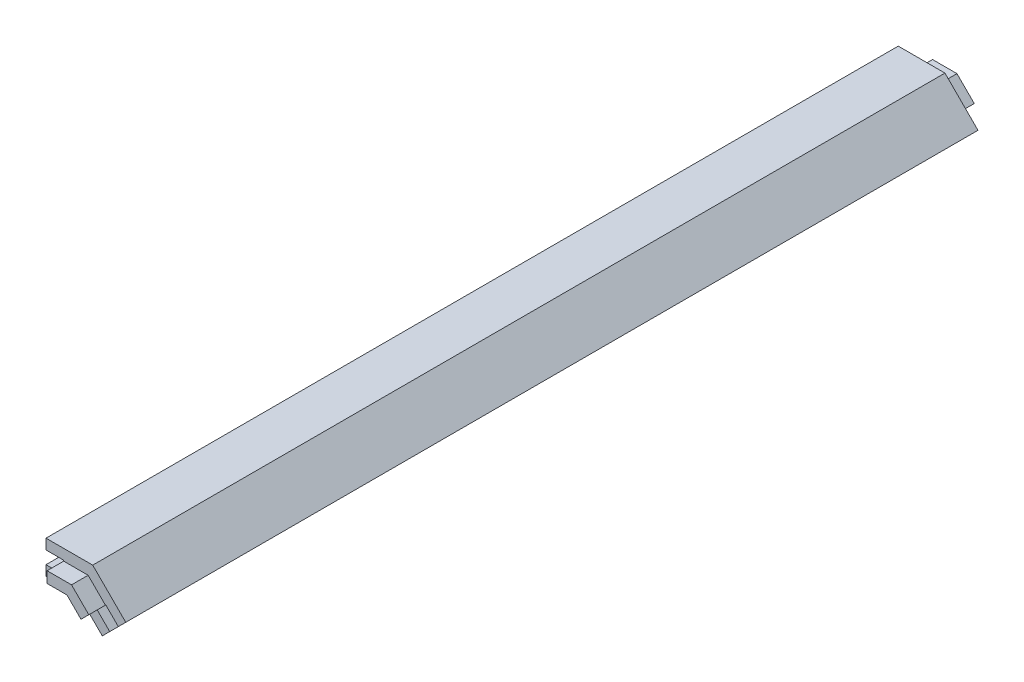
ISO-10303-21;
HEADER;
FILE_DESCRIPTION(('STEP AP214'),'2;1');
FILE_NAME('part.step','',(''),(''),'','','');
FILE_SCHEMA(('AUTOMOTIVE_DESIGN { 1 0 10303 214 1 1 1 1 }'));
ENDSEC;
DATA;
#1=APPLICATION_CONTEXT('core data for automotive mechanical design processes');
#2=APPLICATION_PROTOCOL_DEFINITION('international standard','automotive_design',2000,#1);
#3=PRODUCT_CONTEXT('',#1,'mechanical');
#4=PRODUCT('Part','Part','',(#3));
#5=PRODUCT_RELATED_PRODUCT_CATEGORY('part','',(#4));
#6=PRODUCT_DEFINITION_FORMATION('','',#4);
#7=PRODUCT_DEFINITION_CONTEXT('part definition',#1,'design');
#8=PRODUCT_DEFINITION('design','',#6,#7);
#9=PRODUCT_DEFINITION_SHAPE('','',#8);
#10=(LENGTH_UNIT() NAMED_UNIT(*) SI_UNIT(.MILLI.,.METRE.));
#11=(NAMED_UNIT(*) PLANE_ANGLE_UNIT() SI_UNIT($,.RADIAN.));
#12=(NAMED_UNIT(*) SI_UNIT($,.STERADIAN.) SOLID_ANGLE_UNIT());
#13=UNCERTAINTY_MEASURE_WITH_UNIT(LENGTH_MEASURE(1.E-05),#10,'distance_accuracy_value','');
#14=(GEOMETRIC_REPRESENTATION_CONTEXT(3) GLOBAL_UNCERTAINTY_ASSIGNED_CONTEXT((#13)) GLOBAL_UNIT_ASSIGNED_CONTEXT((#10,
#11,#12)) REPRESENTATION_CONTEXT('',''));
#15=CARTESIAN_POINT('',(0.,0.,0.));
#16=DIRECTION('',(0.,0.,1.));
#17=DIRECTION('',(1.,0.,0.));
#18=AXIS2_PLACEMENT_3D('',#15,#16,#17);
#19=CARTESIAN_POINT('',(0.,0.,392.5));
#20=DIRECTION('',(0.,0.,-1.));
#21=DIRECTION('',(-1.,0.,0.));
#22=AXIS2_PLACEMENT_3D('',#19,#20,#21);
#23=PLANE('',#22);
#24=DIRECTION('',(-1.,0.,0.));
#25=VECTOR('',#24,1.);
#26=CARTESIAN_POINT('',(11.0355339059327,2.5,392.5));
#27=LINE('',#26,#25);
#28=CARTESIAN_POINT('',(11.0355339059327,2.5,392.5));
#29=VERTEX_POINT('',#28);
#30=CARTESIAN_POINT('',(0.,2.5,392.5));
#31=VERTEX_POINT('',#30);
#32=EDGE_CURVE('E61',#29,#31,#27,.T.);
#33=ORIENTED_EDGE('',*,*,#32,.F.);
#34=DIRECTION('',(-0.707106781186548,0.707106781186548,0.));
#35=VECTOR('',#34,1.);
#36=CARTESIAN_POINT('',(18.8388347648318,-5.3033008588991,392.5));
#37=LINE('',#36,#35);
#38=CARTESIAN_POINT('',(18.8388347648318,-5.3033008588991,392.5));
#39=VERTEX_POINT('',#38);
#40=EDGE_CURVE('E530',#39,#29,#37,.T.);
#41=ORIENTED_EDGE('',*,*,#40,.F.);
#42=DIRECTION('',(0.707106781186548,0.707106781186547,0.));
#43=VECTOR('',#42,1.);
#44=CARTESIAN_POINT('',(15.1265241636025,-9.01561146012849,392.5));
#45=LINE('',#44,#43);
#46=CARTESIAN_POINT('',(19.0156114601285,-5.12652416360248,392.5));
#47=VERTEX_POINT('',#46);
#48=EDGE_CURVE('E270',#39,#47,#45,.T.);
#49=ORIENTED_EDGE('',*,*,#48,.T.);
#50=DIRECTION('',(0.707106781186549,-0.707106781186546,0.));
#51=VECTOR('',#50,1.);
#52=CARTESIAN_POINT('',(24.6724657096209,-10.7833784130948,392.5));
#53=LINE('',#52,#51);
#54=CARTESIAN_POINT('',(24.6724657096209,-10.7833784130948,392.5));
#55=VERTEX_POINT('',#54);
#56=EDGE_CURVE('E274',#47,#55,#53,.T.);
#57=ORIENTED_EDGE('',*,*,#56,.T.);
#58=DIRECTION('',(0.707106781186547,0.707106781186548,0.));
#59=VECTOR('',#58,1.);
#60=CARTESIAN_POINT('',(24.6724657096209,-10.7833784130948,392.5));
#61=LINE('',#60,#59);
#62=CARTESIAN_POINT('',(28.031222920257,-7.42462120245874,392.5));
#63=VERTEX_POINT('',#62);
#64=EDGE_CURVE('E277',#55,#63,#61,.T.);
#65=ORIENTED_EDGE('',*,*,#64,.T.);
#66=DIRECTION('',(-0.707106781186548,0.707106781186547,0.));
#67=VECTOR('',#66,1.);
#68=CARTESIAN_POINT('',(28.031222920257,-7.42462120245874,392.5));
#69=LINE('',#68,#67);
#70=CARTESIAN_POINT('',(13.1066017177982,7.50000000000003,392.5));
#71=VERTEX_POINT('',#70);
#72=EDGE_CURVE('E280',#63,#71,#69,.T.);
#73=ORIENTED_EDGE('',*,*,#72,.T.);
#74=DIRECTION('',(-1.,0.,0.));
#75=VECTOR('',#74,1.);
#76=CARTESIAN_POINT('',(13.1066017177982,7.50000000000003,392.5));
#77=LINE('',#76,#75);
#78=CARTESIAN_POINT('',(-8.,7.50000000000003,392.5));
#79=VERTEX_POINT('',#78);
#80=EDGE_CURVE('E283',#71,#79,#77,.T.);
#81=ORIENTED_EDGE('',*,*,#80,.T.);
#82=DIRECTION('',(0.,-1.,0.));
#83=VECTOR('',#82,1.);
#84=CARTESIAN_POINT('',(-8.,7.50000000000003,392.5));
#85=LINE('',#84,#83);
#86=CARTESIAN_POINT('',(-8.,2.875,392.5));
#87=VERTEX_POINT('',#86);
#88=EDGE_CURVE('E286',#79,#87,#85,.T.);
#89=ORIENTED_EDGE('',*,*,#88,.T.);
#90=DIRECTION('',(1.,0.,0.));
#91=VECTOR('',#90,1.);
#92=CARTESIAN_POINT('',(-8.,2.875,392.5));
#93=LINE('',#92,#91);
#94=CARTESIAN_POINT('',(0.,2.875,392.5));
#95=VERTEX_POINT('',#94);
#96=EDGE_CURVE('E289',#87,#95,#93,.T.);
#97=ORIENTED_EDGE('',*,*,#96,.T.);
#98=DIRECTION('',(0.,-1.,0.));
#99=VECTOR('',#98,1.);
#100=CARTESIAN_POINT('',(0.,2.875,392.5));
#101=LINE('',#100,#99);
#102=EDGE_CURVE('E292',#95,#31,#101,.T.);
#103=ORIENTED_EDGE('',*,*,#102,.T.);
#104=EDGE_LOOP('',(#33,#41,#49,#57,#65,#73,#81,#89,#97,#103));
#105=FACE_BOUND('',#104,.T.);
#106=ADVANCED_FACE('F45',(#105),#23,.F.);
#107=DIRECTION('',(0.707106781186547,-0.707106781186548,0.));
#108=VECTOR('',#107,1.);
#109=CARTESIAN_POINT('',(8.96446609406726,-2.5,392.5));
#110=LINE('',#109,#108);
#111=CARTESIAN_POINT('',(8.96446609406726,-2.5,392.5));
#112=VERTEX_POINT('',#111);
#113=CARTESIAN_POINT('',(15.3033008588991,-8.83883476483184,392.5));
#114=VERTEX_POINT('',#113);
#115=EDGE_CURVE('E533',#112,#114,#110,.T.);
#116=ORIENTED_EDGE('',*,*,#115,.F.);
#117=DIRECTION('',(1.,0.,0.));
#118=VECTOR('',#117,1.);
#119=CARTESIAN_POINT('',(0.,-2.5,392.5));
#120=LINE('',#119,#118);
#121=CARTESIAN_POINT('',(0.,-2.5,392.5));
#122=VERTEX_POINT('',#121);
#123=EDGE_CURVE('E69',#122,#112,#120,.T.);
#124=ORIENTED_EDGE('',*,*,#123,.F.);
#125=CARTESIAN_POINT('',(0.,-2.875,392.5));
#126=VERTEX_POINT('',#125);
#127=EDGE_CURVE('E243',#122,#126,#101,.T.);
#128=ORIENTED_EDGE('',*,*,#127,.T.);
#129=DIRECTION('',(-1.,0.,0.));
#130=VECTOR('',#129,1.);
#131=CARTESIAN_POINT('',(-8.,-2.875,392.5));
#132=LINE('',#131,#130);
#133=CARTESIAN_POINT('',(-8.,-2.875,392.5));
#134=VERTEX_POINT('',#133);
#135=EDGE_CURVE('E295',#126,#134,#132,.T.);
#136=ORIENTED_EDGE('',*,*,#135,.T.);
#137=DIRECTION('',(0.,-1.,0.));
#138=VECTOR('',#137,1.);
#139=CARTESIAN_POINT('',(-8.,-2.875,392.5));
#140=LINE('',#139,#138);
#141=CARTESIAN_POINT('',(-8.,-7.5,392.5));
#142=VERTEX_POINT('',#141);
#143=EDGE_CURVE('E298',#134,#142,#140,.T.);
#144=ORIENTED_EDGE('',*,*,#143,.T.);
#145=DIRECTION('',(1.,0.,0.));
#146=VECTOR('',#145,1.);
#147=CARTESIAN_POINT('',(-8.,-7.5,392.5));
#148=LINE('',#147,#146);
#149=CARTESIAN_POINT('',(6.89339828220179,-7.5,392.5));
#150=VERTEX_POINT('',#149);
#151=EDGE_CURVE('E256',#142,#150,#148,.T.);
#152=ORIENTED_EDGE('',*,*,#151,.T.);
#153=DIRECTION('',(0.707106781186547,-0.707106781186547,0.));
#154=VECTOR('',#153,1.);
#155=CARTESIAN_POINT('',(6.89339828220179,-7.5,392.5));
#156=LINE('',#155,#154);
#157=CARTESIAN_POINT('',(17.4246212024587,-18.031222920257,392.5));
#158=VERTEX_POINT('',#157);
#159=EDGE_CURVE('E260',#150,#158,#156,.T.);
#160=ORIENTED_EDGE('',*,*,#159,.T.);
#161=DIRECTION('',(0.707106781186547,0.707106781186549,0.));
#162=VECTOR('',#161,1.);
#163=CARTESIAN_POINT('',(17.4246212024587,-18.031222920257,392.5));
#164=LINE('',#163,#162);
#165=CARTESIAN_POINT('',(20.7833784130948,-14.6724657096209,392.5));
#166=VERTEX_POINT('',#165);
#167=EDGE_CURVE('E264',#158,#166,#164,.T.);
#168=ORIENTED_EDGE('',*,*,#167,.T.);
#169=DIRECTION('',(-0.707106781186549,0.707106781186546,0.));
#170=VECTOR('',#169,1.);
#171=CARTESIAN_POINT('',(15.1265241636025,-9.01561146012849,392.5));
#172=LINE('',#171,#170);
#173=CARTESIAN_POINT('',(15.1265241636025,-9.01561146012849,392.5));
#174=VERTEX_POINT('',#173);
#175=EDGE_CURVE('E267',#166,#174,#172,.T.);
#176=ORIENTED_EDGE('',*,*,#175,.T.);
#177=EDGE_CURVE('E271',#174,#114,#45,.T.);
#178=ORIENTED_EDGE('',*,*,#177,.T.);
#179=EDGE_LOOP('',(#116,#124,#128,#136,#144,#152,#160,#168,#176,#178));
#180=FACE_BOUND('',#179,.T.);
#181=ADVANCED_FACE('F476',(#180),#23,.F.);
#182=CARTESIAN_POINT('',(8.96446609406726,-2.5,7.5));
#183=DIRECTION('',(0.707106781186549,0.707106781186546,0.));
#184=DIRECTION('',(-0.707106781186546,0.707106781186549,0.));
#185=AXIS2_PLACEMENT_3D('',#182,#183,#184);
#186=PLANE('',#185);
#187=DIRECTION('',(0.707106781186546,-0.707106781186549,0.));
#188=VECTOR('',#187,1.);
#189=CARTESIAN_POINT('',(8.96446609406726,-2.5,0.));
#190=LINE('',#189,#188);
#191=CARTESIAN_POINT('',(8.96446609406726,-2.5,0.));
#192=VERTEX_POINT('',#191);
#193=CARTESIAN_POINT('',(15.3033008588991,-8.83883476483185,0.));
#194=VERTEX_POINT('',#193);
#195=EDGE_CURVE('E398',#192,#194,#190,.T.);
#196=ORIENTED_EDGE('',*,*,#195,.T.);
#197=DIRECTION('',(0.,0.,-1.));
#198=VECTOR('',#197,1.);
#199=CARTESIAN_POINT('',(15.3033008588991,-8.83883476483185,7.5));
#200=LINE('',#199,#198);
#201=CARTESIAN_POINT('',(15.3033008588991,-8.83883476483185,7.5));
#202=VERTEX_POINT('',#201);
#203=EDGE_CURVE('E11',#202,#194,#200,.T.);
#204=ORIENTED_EDGE('',*,*,#203,.F.);
#205=DIRECTION('',(0.707106781186546,-0.707106781186549,0.));
#206=VECTOR('',#205,1.);
#207=CARTESIAN_POINT('',(8.96446609406726,-2.5,7.5));
#208=LINE('',#207,#206);
#209=CARTESIAN_POINT('',(8.96446609406726,-2.5,7.5));
#210=VERTEX_POINT('',#209);
#211=EDGE_CURVE('E399',#210,#202,#208,.T.);
#212=ORIENTED_EDGE('',*,*,#211,.F.);
#213=DIRECTION('',(0.,0.,-1.));
#214=VECTOR('',#213,1.);
#215=CARTESIAN_POINT('',(8.96446609406726,-2.5,7.5));
#216=LINE('',#215,#214);
#217=EDGE_CURVE('E416',#210,#192,#216,.T.);
#218=ORIENTED_EDGE('',*,*,#217,.T.);
#219=EDGE_LOOP('',(#196,#204,#212,#218));
#220=FACE_BOUND('',#219,.T.);
#221=ADVANCED_FACE('F47',(#220),#186,.F.);
#222=CARTESIAN_POINT('',(15.3033008588991,-8.83883476483185,7.5));
#223=DIRECTION('',(-0.707106781186546,0.707106781186549,0.));
#224=DIRECTION('',(-0.707106781186549,-0.707106781186546,0.));
#225=AXIS2_PLACEMENT_3D('',#222,#223,#224);
#226=PLANE('',#225);
#227=DIRECTION('',(0.707106781186549,0.707106781186546,0.));
#228=VECTOR('',#227,1.);
#229=CARTESIAN_POINT('',(15.3033008588991,-8.83883476483185,0.));
#230=LINE('',#229,#228);
#231=CARTESIAN_POINT('',(18.8388347648318,-5.30330085889912,0.));
#232=VERTEX_POINT('',#231);
#233=EDGE_CURVE('E420',#194,#232,#230,.T.);
#234=ORIENTED_EDGE('',*,*,#233,.T.);
#235=DIRECTION('',(0.,0.,-1.));
#236=VECTOR('',#235,1.);
#237=CARTESIAN_POINT('',(18.8388347648318,-5.30330085889912,7.5));
#238=LINE('',#237,#236);
#239=CARTESIAN_POINT('',(18.8388347648318,-5.30330085889912,7.5));
#240=VERTEX_POINT('',#239);
#241=EDGE_CURVE('E54',#240,#232,#238,.T.);
#242=ORIENTED_EDGE('',*,*,#241,.F.);
#243=DIRECTION('',(0.707106781186548,0.707106781186547,0.));
#244=VECTOR('',#243,1.);
#245=CARTESIAN_POINT('',(15.1265241636025,-9.01561146012849,7.5));
#246=LINE('',#245,#244);
#247=CARTESIAN_POINT('',(19.0156114601285,-5.12652416360248,7.5));
#248=VERTEX_POINT('',#247);
#249=EDGE_CURVE('E310',#240,#248,#246,.T.);
#250=ORIENTED_EDGE('',*,*,#249,.T.);
#251=DIRECTION('',(0.,0.,-1.));
#252=VECTOR('',#251,1.);
#253=CARTESIAN_POINT('',(19.0156114601285,-5.12652416360248,392.5));
#254=LINE('',#253,#252);
#255=EDGE_CURVE('E378',#47,#248,#254,.T.);
#256=ORIENTED_EDGE('',*,*,#255,.F.);
#257=ORIENTED_EDGE('',*,*,#48,.F.);
#258=DIRECTION('',(0.,0.,-1.));
#259=VECTOR('',#258,1.);
#260=CARTESIAN_POINT('',(18.8388347648318,-5.3033008588991,400.));
#261=LINE('',#260,#259);
#262=CARTESIAN_POINT('',(18.8388347648318,-5.3033008588991,400.));
#263=VERTEX_POINT('',#262);
#264=EDGE_CURVE('E516',#263,#39,#261,.T.);
#265=ORIENTED_EDGE('',*,*,#264,.F.);
#266=DIRECTION('',(0.707106781186547,0.707106781186548,0.));
#267=VECTOR('',#266,1.);
#268=CARTESIAN_POINT('',(15.3033008588991,-8.83883476483184,400.));
#269=LINE('',#268,#267);
#270=CARTESIAN_POINT('',(15.3033008588991,-8.83883476483184,400.));
#271=VERTEX_POINT('',#270);
#272=EDGE_CURVE('E513',#271,#263,#269,.T.);
#273=ORIENTED_EDGE('',*,*,#272,.F.);
#274=DIRECTION('',(0.,0.,-1.));
#275=VECTOR('',#274,1.);
#276=CARTESIAN_POINT('',(15.3033008588991,-8.83883476483184,400.));
#277=LINE('',#276,#275);
#278=EDGE_CURVE('E252',#271,#114,#277,.T.);
#279=ORIENTED_EDGE('',*,*,#278,.T.);
#280=ORIENTED_EDGE('',*,*,#177,.F.);
#281=DIRECTION('',(0.,0.,-1.));
#282=VECTOR('',#281,1.);
#283=CARTESIAN_POINT('',(15.1265241636025,-9.01561146012849,392.5));
#284=LINE('',#283,#282);
#285=CARTESIAN_POINT('',(15.1265241636025,-9.01561146012849,7.5));
#286=VERTEX_POINT('',#285);
#287=EDGE_CURVE('E382',#174,#286,#284,.T.);
#288=ORIENTED_EDGE('',*,*,#287,.T.);
#289=EDGE_CURVE('E311',#286,#202,#246,.T.);
#290=ORIENTED_EDGE('',*,*,#289,.T.);
#291=ORIENTED_EDGE('',*,*,#203,.T.);
#292=EDGE_LOOP('',(#234,#242,#250,#256,#257,#265,#273,#279,#280,#288,#290,#291));
#293=FACE_BOUND('',#292,.T.);
#294=ADVANCED_FACE('F456',(#293),#226,.F.);
#295=CARTESIAN_POINT('',(11.0355339059327,2.5,7.5));
#296=DIRECTION('',(0.707106781186549,0.707106781186546,0.));
#297=DIRECTION('',(-0.707106781186546,0.707106781186549,0.));
#298=AXIS2_PLACEMENT_3D('',#295,#296,#297);
#299=PLANE('',#298);
#300=DIRECTION('',(0.707106781186546,-0.707106781186549,0.));
#301=VECTOR('',#300,1.);
#302=CARTESIAN_POINT('',(11.0355339059327,2.5,0.));
#303=LINE('',#302,#301);
#304=CARTESIAN_POINT('',(11.0355339059327,2.5,0.));
#305=VERTEX_POINT('',#304);
#306=EDGE_CURVE('E424',#305,#232,#303,.T.);
#307=ORIENTED_EDGE('',*,*,#306,.F.);
#308=DIRECTION('',(0.,0.,-1.));
#309=VECTOR('',#308,1.);
#310=CARTESIAN_POINT('',(11.0355339059327,2.5,7.5));
#311=LINE('',#310,#309);
#312=CARTESIAN_POINT('',(11.0355339059327,2.5,7.5));
#313=VERTEX_POINT('',#312);
#314=EDGE_CURVE('E447',#313,#305,#311,.T.);
#315=ORIENTED_EDGE('',*,*,#314,.F.);
#316=DIRECTION('',(0.707106781186546,-0.707106781186549,0.));
#317=VECTOR('',#316,1.);
#318=CARTESIAN_POINT('',(11.0355339059327,2.5,7.5));
#319=LINE('',#318,#317);
#320=EDGE_CURVE('E403',#313,#240,#319,.T.);
#321=ORIENTED_EDGE('',*,*,#320,.T.);
#322=ORIENTED_EDGE('',*,*,#241,.T.);
#323=EDGE_LOOP('',(#307,#315,#321,#322));
#324=FACE_BOUND('',#323,.T.);
#325=ADVANCED_FACE('F452',(#324),#299,.T.);
#326=CARTESIAN_POINT('',(0.,2.5,7.5));
#327=DIRECTION('',(0.,1.,0.));
#328=DIRECTION('',(0.,0.,1.));
#329=AXIS2_PLACEMENT_3D('',#326,#327,#328);
#330=PLANE('',#329);
#331=DIRECTION('',(1.,0.,0.));
#332=VECTOR('',#331,1.);
#333=CARTESIAN_POINT('',(0.,2.5,0.));
#334=LINE('',#333,#332);
#335=CARTESIAN_POINT('',(0.,2.5,0.));
#336=VERTEX_POINT('',#335);
#337=EDGE_CURVE('E428',#336,#305,#334,.T.);
#338=ORIENTED_EDGE('',*,*,#337,.F.);
#339=DIRECTION('',(0.,0.,-1.));
#340=VECTOR('',#339,1.);
#341=CARTESIAN_POINT('',(0.,2.5,7.5));
#342=LINE('',#341,#340);
#343=CARTESIAN_POINT('',(0.,2.5,7.5));
#344=VERTEX_POINT('',#343);
#345=EDGE_CURVE('E444',#344,#336,#342,.T.);
#346=ORIENTED_EDGE('',*,*,#345,.F.);
#347=DIRECTION('',(1.,0.,0.));
#348=VECTOR('',#347,1.);
#349=CARTESIAN_POINT('',(0.,2.5,7.5));
#350=LINE('',#349,#348);
#351=EDGE_CURVE('E408',#344,#313,#350,.T.);
#352=ORIENTED_EDGE('',*,*,#351,.T.);
#353=ORIENTED_EDGE('',*,*,#314,.T.);
#354=EDGE_LOOP('',(#338,#346,#352,#353));
#355=FACE_BOUND('',#354,.T.);
#356=ADVANCED_FACE('F464',(#355),#330,.T.);
#357=CARTESIAN_POINT('',(0.,2.5,7.5));
#358=DIRECTION('',(1.,0.,0.));
#359=DIRECTION('',(0.,0.,-1.));
#360=AXIS2_PLACEMENT_3D('',#357,#358,#359);
#361=PLANE('',#360);
#362=DIRECTION('',(0.,-1.,0.));
#363=VECTOR('',#362,1.);
#364=CARTESIAN_POINT('',(0.,2.5,0.));
#365=LINE('',#364,#363);
#366=CARTESIAN_POINT('',(0.,-2.5,0.));
#367=VERTEX_POINT('',#366);
#368=EDGE_CURVE('E432',#336,#367,#365,.T.);
#369=ORIENTED_EDGE('',*,*,#368,.T.);
#370=DIRECTION('',(0.,0.,-1.));
#371=VECTOR('',#370,1.);
#372=CARTESIAN_POINT('',(0.,-2.5,7.5));
#373=LINE('',#372,#371);
#374=CARTESIAN_POINT('',(0.,-2.5,7.5));
#375=VERTEX_POINT('',#374);
#376=EDGE_CURVE('E440',#375,#367,#373,.T.);
#377=ORIENTED_EDGE('',*,*,#376,.F.);
#378=DIRECTION('',(0.,-1.,0.));
#379=VECTOR('',#378,1.);
#380=CARTESIAN_POINT('',(0.,2.875,7.5));
#381=LINE('',#380,#379);
#382=CARTESIAN_POINT('',(0.,-2.875,7.5));
#383=VERTEX_POINT('',#382);
#384=EDGE_CURVE('E333',#375,#383,#381,.T.);
#385=ORIENTED_EDGE('',*,*,#384,.T.);
#386=DIRECTION('',(0.,0.,-1.));
#387=VECTOR('',#386,1.);
#388=CARTESIAN_POINT('',(0.,-2.875,392.5));
#389=LINE('',#388,#387);
#390=EDGE_CURVE('E350',#126,#383,#389,.T.);
#391=ORIENTED_EDGE('',*,*,#390,.F.);
#392=ORIENTED_EDGE('',*,*,#127,.F.);
#393=DIRECTION('',(0.,0.,-1.));
#394=VECTOR('',#393,1.);
#395=CARTESIAN_POINT('',(0.,-2.5,400.));
#396=LINE('',#395,#394);
#397=CARTESIAN_POINT('',(0.,-2.5,400.));
#398=VERTEX_POINT('',#397);
#399=EDGE_CURVE('E223',#398,#122,#396,.T.);
#400=ORIENTED_EDGE('',*,*,#399,.F.);
#401=DIRECTION('',(0.,-1.,0.));
#402=VECTOR('',#401,1.);
#403=CARTESIAN_POINT('',(0.,2.5,400.));
#404=LINE('',#403,#402);
#405=CARTESIAN_POINT('',(0.,2.5,400.));
#406=VERTEX_POINT('',#405);
#407=EDGE_CURVE('E230',#406,#398,#404,.T.);
#408=ORIENTED_EDGE('',*,*,#407,.F.);
#409=DIRECTION('',(0.,0.,-1.));
#410=VECTOR('',#409,1.);
#411=CARTESIAN_POINT('',(0.,2.5,400.));
#412=LINE('',#411,#410);
#413=EDGE_CURVE('E525',#406,#31,#412,.T.);
#414=ORIENTED_EDGE('',*,*,#413,.T.);
#415=ORIENTED_EDGE('',*,*,#102,.F.);
#416=DIRECTION('',(0.,0.,-1.));
#417=VECTOR('',#416,1.);
#418=CARTESIAN_POINT('',(0.,2.875,392.5));
#419=LINE('',#418,#417);
#420=CARTESIAN_POINT('',(0.,2.875,7.5));
#421=VERTEX_POINT('',#420);
#422=EDGE_CURVE('E354',#95,#421,#419,.T.);
#423=ORIENTED_EDGE('',*,*,#422,.T.);
#424=EDGE_CURVE('E334',#421,#344,#381,.T.);
#425=ORIENTED_EDGE('',*,*,#424,.T.);
#426=ORIENTED_EDGE('',*,*,#345,.T.);
#427=EDGE_LOOP('',(#369,#377,#385,#391,#392,#400,#408,#414,#415,#423,#425,#426));
#428=FACE_BOUND('',#427,.T.);
#429=ADVANCED_FACE('F241',(#428),#361,.F.);
#430=CARTESIAN_POINT('',(0.,-2.5,7.5));
#431=DIRECTION('',(0.,1.,0.));
#432=DIRECTION('',(0.,0.,1.));
#433=AXIS2_PLACEMENT_3D('',#430,#431,#432);
#434=PLANE('',#433);
#435=DIRECTION('',(1.,0.,0.));
#436=VECTOR('',#435,1.);
#437=CARTESIAN_POINT('',(0.,-2.5,0.));
#438=LINE('',#437,#436);
#439=EDGE_CURVE('E404',#367,#192,#438,.T.);
#440=ORIENTED_EDGE('',*,*,#439,.T.);
#441=ORIENTED_EDGE('',*,*,#217,.F.);
#442=DIRECTION('',(1.,0.,0.));
#443=VECTOR('',#442,1.);
#444=CARTESIAN_POINT('',(0.,-2.5,7.5));
#445=LINE('',#444,#443);
#446=EDGE_CURVE('E412',#375,#210,#445,.T.);
#447=ORIENTED_EDGE('',*,*,#446,.F.);
#448=ORIENTED_EDGE('',*,*,#376,.T.);
#449=EDGE_LOOP('',(#440,#441,#447,#448));
#450=FACE_BOUND('',#449,.T.);
#451=ADVANCED_FACE('F606',(#450),#434,.F.);
#452=CARTESIAN_POINT('',(0.,0.,0.));
#453=DIRECTION('',(0.,0.,1.));
#454=DIRECTION('',(1.,0.,0.));
#455=AXIS2_PLACEMENT_3D('',#452,#453,#454);
#456=PLANE('',#455);
#457=ORIENTED_EDGE('',*,*,#195,.F.);
#458=ORIENTED_EDGE('',*,*,#439,.F.);
#459=ORIENTED_EDGE('',*,*,#368,.F.);
#460=ORIENTED_EDGE('',*,*,#337,.T.);
#461=ORIENTED_EDGE('',*,*,#306,.T.);
#462=ORIENTED_EDGE('',*,*,#233,.F.);
#463=EDGE_LOOP('',(#457,#458,#459,#460,#461,#462));
#464=FACE_BOUND('',#463,.T.);
#465=ADVANCED_FACE('F459',(#464),#456,.F.);
#466=CARTESIAN_POINT('',(0.,0.,7.5));
#467=DIRECTION('',(0.,0.,-1.));
#468=DIRECTION('',(-1.,0.,0.));
#469=AXIS2_PLACEMENT_3D('',#466,#467,#468);
#470=PLANE('',#469);
#471=ORIENTED_EDGE('',*,*,#320,.F.);
#472=ORIENTED_EDGE('',*,*,#351,.F.);
#473=ORIENTED_EDGE('',*,*,#424,.F.);
#474=DIRECTION('',(1.,0.,0.));
#475=VECTOR('',#474,1.);
#476=CARTESIAN_POINT('',(-8.,2.875,7.5));
#477=LINE('',#476,#475);
#478=CARTESIAN_POINT('',(-8.,2.875,7.5));
#479=VERTEX_POINT('',#478);
#480=EDGE_CURVE('E330',#479,#421,#477,.T.);
#481=ORIENTED_EDGE('',*,*,#480,.F.);
#482=DIRECTION('',(0.,-1.,0.));
#483=VECTOR('',#482,1.);
#484=CARTESIAN_POINT('',(-8.,7.50000000000003,7.5));
#485=LINE('',#484,#483);
#486=CARTESIAN_POINT('',(-8.,7.50000000000003,7.5));
#487=VERTEX_POINT('',#486);
#488=EDGE_CURVE('E327',#487,#479,#485,.T.);
#489=ORIENTED_EDGE('',*,*,#488,.F.);
#490=DIRECTION('',(-1.,0.,0.));
#491=VECTOR('',#490,1.);
#492=CARTESIAN_POINT('',(13.1066017177982,7.50000000000003,7.5));
#493=LINE('',#492,#491);
#494=CARTESIAN_POINT('',(13.1066017177982,7.50000000000003,7.5));
#495=VERTEX_POINT('',#494);
#496=EDGE_CURVE('E324',#495,#487,#493,.T.);
#497=ORIENTED_EDGE('',*,*,#496,.F.);
#498=DIRECTION('',(-0.707106781186548,0.707106781186547,0.));
#499=VECTOR('',#498,1.);
#500=CARTESIAN_POINT('',(28.031222920257,-7.42462120245874,7.5));
#501=LINE('',#500,#499);
#502=CARTESIAN_POINT('',(28.031222920257,-7.42462120245874,7.5));
#503=VERTEX_POINT('',#502);
#504=EDGE_CURVE('E321',#503,#495,#501,.T.);
#505=ORIENTED_EDGE('',*,*,#504,.F.);
#506=DIRECTION('',(0.707106781186547,0.707106781186548,0.));
#507=VECTOR('',#506,1.);
#508=CARTESIAN_POINT('',(24.6724657096209,-10.7833784130948,7.5));
#509=LINE('',#508,#507);
#510=CARTESIAN_POINT('',(24.6724657096209,-10.7833784130948,7.5));
#511=VERTEX_POINT('',#510);
#512=EDGE_CURVE('E318',#511,#503,#509,.T.);
#513=ORIENTED_EDGE('',*,*,#512,.F.);
#514=DIRECTION('',(0.707106781186549,-0.707106781186546,0.));
#515=VECTOR('',#514,1.);
#516=CARTESIAN_POINT('',(24.6724657096209,-10.7833784130948,7.5));
#517=LINE('',#516,#515);
#518=EDGE_CURVE('E315',#248,#511,#517,.T.);
#519=ORIENTED_EDGE('',*,*,#518,.F.);
#520=ORIENTED_EDGE('',*,*,#249,.F.);
#521=EDGE_LOOP('',(#471,#472,#473,#481,#489,#497,#505,#513,#519,#520));
#522=FACE_BOUND('',#521,.T.);
#523=ADVANCED_FACE('F468',(#522),#470,.T.);
#524=CARTESIAN_POINT('',(-8.,-7.5,392.5));
#525=DIRECTION('',(0.,1.,0.));
#526=DIRECTION('',(0.,0.,1.));
#527=AXIS2_PLACEMENT_3D('',#524,#525,#526);
#528=PLANE('',#527);
#529=DIRECTION('',(1.,0.,0.));
#530=VECTOR('',#529,1.);
#531=CARTESIAN_POINT('',(-8.,-7.5,7.5));
#532=LINE('',#531,#530);
#533=CARTESIAN_POINT('',(-8.,-7.5,7.5));
#534=VERTEX_POINT('',#533);
#535=CARTESIAN_POINT('',(6.89339828220179,-7.5,7.5));
#536=VERTEX_POINT('',#535);
#537=EDGE_CURVE('E245',#534,#536,#532,.T.);
#538=ORIENTED_EDGE('',*,*,#537,.T.);
#539=DIRECTION('',(0.,0.,-1.));
#540=VECTOR('',#539,1.);
#541=CARTESIAN_POINT('',(6.89339828220179,-7.5,392.5));
#542=LINE('',#541,#540);
#543=EDGE_CURVE('E394',#150,#536,#542,.T.);
#544=ORIENTED_EDGE('',*,*,#543,.F.);
#545=ORIENTED_EDGE('',*,*,#151,.F.);
#546=DIRECTION('',(0.,0.,-1.));
#547=VECTOR('',#546,1.);
#548=CARTESIAN_POINT('',(-8.,-7.5,392.5));
#549=LINE('',#548,#547);
#550=EDGE_CURVE('E300',#142,#534,#549,.T.);
#551=ORIENTED_EDGE('',*,*,#550,.T.);
#552=EDGE_LOOP('',(#538,#544,#545,#551));
#553=FACE_BOUND('',#552,.T.);
#554=ADVANCED_FACE('F492',(#553),#528,.F.);
#555=CARTESIAN_POINT('',(6.89339828220179,-7.5,392.5));
#556=DIRECTION('',(0.707106781186548,0.707106781186547,0.));
#557=DIRECTION('',(-0.707106781186547,0.707106781186548,0.));
#558=AXIS2_PLACEMENT_3D('',#555,#556,#557);
#559=PLANE('',#558);
#560=DIRECTION('',(0.707106781186547,-0.707106781186547,0.));
#561=VECTOR('',#560,1.);
#562=CARTESIAN_POINT('',(6.89339828220179,-7.5,7.5));
#563=LINE('',#562,#561);
#564=CARTESIAN_POINT('',(17.4246212024587,-18.031222920257,7.5));
#565=VERTEX_POINT('',#564);
#566=EDGE_CURVE('E250',#536,#565,#563,.T.);
#567=ORIENTED_EDGE('',*,*,#566,.T.);
#568=DIRECTION('',(0.,0.,-1.));
#569=VECTOR('',#568,1.);
#570=CARTESIAN_POINT('',(17.4246212024587,-18.031222920257,392.5));
#571=LINE('',#570,#569);
#572=EDGE_CURVE('E390',#158,#565,#571,.T.);
#573=ORIENTED_EDGE('',*,*,#572,.F.);
#574=ORIENTED_EDGE('',*,*,#159,.F.);
#575=ORIENTED_EDGE('',*,*,#543,.T.);
#576=EDGE_LOOP('',(#567,#573,#574,#575));
#577=FACE_BOUND('',#576,.T.);
#578=ADVANCED_FACE('F495',(#577),#559,.F.);
#579=CARTESIAN_POINT('',(17.4246212024587,-18.031222920257,392.5));
#580=DIRECTION('',(-0.707106781186549,0.707106781186546,0.));
#581=DIRECTION('',(-0.707106781186546,-0.707106781186549,0.));
#582=AXIS2_PLACEMENT_3D('',#579,#580,#581);
#583=PLANE('',#582);
#584=DIRECTION('',(0.707106781186547,0.707106781186549,0.));
#585=VECTOR('',#584,1.);
#586=CARTESIAN_POINT('',(17.4246212024587,-18.031222920257,7.5));
#587=LINE('',#586,#585);
#588=CARTESIAN_POINT('',(20.7833784130948,-14.6724657096209,7.5));
#589=VERTEX_POINT('',#588);
#590=EDGE_CURVE('E304',#565,#589,#587,.T.);
#591=ORIENTED_EDGE('',*,*,#590,.T.);
#592=DIRECTION('',(0.,0.,-1.));
#593=VECTOR('',#592,1.);
#594=CARTESIAN_POINT('',(20.7833784130948,-14.6724657096209,392.5));
#595=LINE('',#594,#593);
#596=EDGE_CURVE('E386',#166,#589,#595,.T.);
#597=ORIENTED_EDGE('',*,*,#596,.F.);
#598=ORIENTED_EDGE('',*,*,#167,.F.);
#599=ORIENTED_EDGE('',*,*,#572,.T.);
#600=EDGE_LOOP('',(#591,#597,#598,#599));
#601=FACE_BOUND('',#600,.T.);
#602=ADVANCED_FACE('F500',(#601),#583,.F.);
#603=CARTESIAN_POINT('',(15.1265241636025,-9.01561146012849,392.5));
#604=DIRECTION('',(-0.707106781186546,-0.707106781186549,0.));
#605=DIRECTION('',(0.707106781186549,-0.707106781186546,0.));
#606=AXIS2_PLACEMENT_3D('',#603,#604,#605);
#607=PLANE('',#606);
#608=DIRECTION('',(-0.707106781186549,0.707106781186546,0.));
#609=VECTOR('',#608,1.);
#610=CARTESIAN_POINT('',(15.1265241636025,-9.01561146012849,7.5));
#611=LINE('',#610,#609);
#612=EDGE_CURVE('E307',#589,#286,#611,.T.);
#613=ORIENTED_EDGE('',*,*,#612,.T.);
#614=ORIENTED_EDGE('',*,*,#287,.F.);
#615=ORIENTED_EDGE('',*,*,#175,.F.);
#616=ORIENTED_EDGE('',*,*,#596,.T.);
#617=EDGE_LOOP('',(#613,#614,#615,#616));
#618=FACE_BOUND('',#617,.T.);
#619=ADVANCED_FACE('F506',(#618),#607,.F.);
#620=CARTESIAN_POINT('',(24.6724657096209,-10.7833784130948,392.5));
#621=DIRECTION('',(0.707106781186546,0.707106781186549,0.));
#622=DIRECTION('',(-0.707106781186549,0.707106781186546,0.));
#623=AXIS2_PLACEMENT_3D('',#620,#621,#622);
#624=PLANE('',#623);
#625=ORIENTED_EDGE('',*,*,#518,.T.);
#626=DIRECTION('',(0.,0.,-1.));
#627=VECTOR('',#626,1.);
#628=CARTESIAN_POINT('',(24.6724657096209,-10.7833784130948,392.5));
#629=LINE('',#628,#627);
#630=EDGE_CURVE('E374',#55,#511,#629,.T.);
#631=ORIENTED_EDGE('',*,*,#630,.F.);
#632=ORIENTED_EDGE('',*,*,#56,.F.);
#633=ORIENTED_EDGE('',*,*,#255,.T.);
#634=EDGE_LOOP('',(#625,#631,#632,#633));
#635=FACE_BOUND('',#634,.T.);
#636=ADVANCED_FACE('F591',(#635),#624,.F.);
#637=CARTESIAN_POINT('',(24.6724657096209,-10.7833784130948,392.5));
#638=DIRECTION('',(-0.707106781186548,0.707106781186547,0.));
#639=DIRECTION('',(-0.707106781186547,-0.707106781186548,0.));
#640=AXIS2_PLACEMENT_3D('',#637,#638,#639);
#641=PLANE('',#640);
#642=ORIENTED_EDGE('',*,*,#512,.T.);
#643=DIRECTION('',(0.,0.,-1.));
#644=VECTOR('',#643,1.);
#645=CARTESIAN_POINT('',(28.031222920257,-7.42462120245874,392.5));
#646=LINE('',#645,#644);
#647=EDGE_CURVE('E370',#63,#503,#646,.T.);
#648=ORIENTED_EDGE('',*,*,#647,.F.);
#649=ORIENTED_EDGE('',*,*,#64,.F.);
#650=ORIENTED_EDGE('',*,*,#630,.T.);
#651=EDGE_LOOP('',(#642,#648,#649,#650));
#652=FACE_BOUND('',#651,.T.);
#653=ADVANCED_FACE('F587',(#652),#641,.F.);
#654=CARTESIAN_POINT('',(28.031222920257,-7.42462120245874,392.5));
#655=DIRECTION('',(-0.707106781186547,-0.707106781186548,0.));
#656=DIRECTION('',(0.707106781186548,-0.707106781186547,0.));
#657=AXIS2_PLACEMENT_3D('',#654,#655,#656);
#658=PLANE('',#657);
#659=ORIENTED_EDGE('',*,*,#504,.T.);
#660=DIRECTION('',(0.,0.,-1.));
#661=VECTOR('',#660,1.);
#662=CARTESIAN_POINT('',(13.1066017177982,7.50000000000003,392.5));
#663=LINE('',#662,#661);
#664=EDGE_CURVE('E366',#71,#495,#663,.T.);
#665=ORIENTED_EDGE('',*,*,#664,.F.);
#666=ORIENTED_EDGE('',*,*,#72,.F.);
#667=ORIENTED_EDGE('',*,*,#647,.T.);
#668=EDGE_LOOP('',(#659,#665,#666,#667));
#669=FACE_BOUND('',#668,.T.);
#670=ADVANCED_FACE('F583',(#669),#658,.F.);
#671=CARTESIAN_POINT('',(13.1066017177982,7.50000000000003,392.5));
#672=DIRECTION('',(0.,-1.,0.));
#673=DIRECTION('',(1.,0.,0.));
#674=AXIS2_PLACEMENT_3D('',#671,#672,#673);
#675=PLANE('',#674);
#676=ORIENTED_EDGE('',*,*,#496,.T.);
#677=DIRECTION('',(0.,0.,-1.));
#678=VECTOR('',#677,1.);
#679=CARTESIAN_POINT('',(-8.,7.50000000000003,392.5));
#680=LINE('',#679,#678);
#681=EDGE_CURVE('E362',#79,#487,#680,.T.);
#682=ORIENTED_EDGE('',*,*,#681,.F.);
#683=ORIENTED_EDGE('',*,*,#80,.F.);
#684=ORIENTED_EDGE('',*,*,#664,.T.);
#685=EDGE_LOOP('',(#676,#682,#683,#684));
#686=FACE_BOUND('',#685,.T.);
#687=ADVANCED_FACE('F579',(#686),#675,.F.);
#688=CARTESIAN_POINT('',(-8.,7.50000000000003,392.5));
#689=DIRECTION('',(1.,0.,0.));
#690=DIRECTION('',(0.,0.,-1.));
#691=AXIS2_PLACEMENT_3D('',#688,#689,#690);
#692=PLANE('',#691);
#693=ORIENTED_EDGE('',*,*,#488,.T.);
#694=DIRECTION('',(0.,0.,-1.));
#695=VECTOR('',#694,1.);
#696=CARTESIAN_POINT('',(-8.,2.875,392.5));
#697=LINE('',#696,#695);
#698=EDGE_CURVE('E358',#87,#479,#697,.T.);
#699=ORIENTED_EDGE('',*,*,#698,.F.);
#700=ORIENTED_EDGE('',*,*,#88,.F.);
#701=ORIENTED_EDGE('',*,*,#681,.T.);
#702=EDGE_LOOP('',(#693,#699,#700,#701));
#703=FACE_BOUND('',#702,.T.);
#704=ADVANCED_FACE('F575',(#703),#692,.F.);
#705=CARTESIAN_POINT('',(-8.,2.875,392.5));
#706=DIRECTION('',(0.,1.,0.));
#707=DIRECTION('',(-1.,0.,0.));
#708=AXIS2_PLACEMENT_3D('',#705,#706,#707);
#709=PLANE('',#708);
#710=ORIENTED_EDGE('',*,*,#480,.T.);
#711=ORIENTED_EDGE('',*,*,#422,.F.);
#712=ORIENTED_EDGE('',*,*,#96,.F.);
#713=ORIENTED_EDGE('',*,*,#698,.T.);
#714=EDGE_LOOP('',(#710,#711,#712,#713));
#715=FACE_BOUND('',#714,.T.);
#716=ADVANCED_FACE('F572',(#715),#709,.F.);
#717=CARTESIAN_POINT('',(-8.,-2.875,392.5));
#718=DIRECTION('',(0.,-1.,0.));
#719=DIRECTION('',(1.,0.,0.));
#720=AXIS2_PLACEMENT_3D('',#717,#718,#719);
#721=PLANE('',#720);
#722=DIRECTION('',(-1.,0.,0.));
#723=VECTOR('',#722,1.);
#724=CARTESIAN_POINT('',(-8.,-2.875,7.5));
#725=LINE('',#724,#723);
#726=CARTESIAN_POINT('',(-8.,-2.875,7.5));
#727=VERTEX_POINT('',#726);
#728=EDGE_CURVE('E338',#383,#727,#725,.T.);
#729=ORIENTED_EDGE('',*,*,#728,.T.);
#730=DIRECTION('',(0.,0.,-1.));
#731=VECTOR('',#730,1.);
#732=CARTESIAN_POINT('',(-8.,-2.875,392.5));
#733=LINE('',#732,#731);
#734=EDGE_CURVE('E346',#134,#727,#733,.T.);
#735=ORIENTED_EDGE('',*,*,#734,.F.);
#736=ORIENTED_EDGE('',*,*,#135,.F.);
#737=ORIENTED_EDGE('',*,*,#390,.T.);
#738=EDGE_LOOP('',(#729,#735,#736,#737));
#739=FACE_BOUND('',#738,.T.);
#740=ADVANCED_FACE('F482',(#739),#721,.F.);
#741=CARTESIAN_POINT('',(-8.,-2.875,392.5));
#742=DIRECTION('',(1.,0.,0.));
#743=DIRECTION('',(0.,0.,-1.));
#744=AXIS2_PLACEMENT_3D('',#741,#742,#743);
#745=PLANE('',#744);
#746=DIRECTION('',(0.,-1.,0.));
#747=VECTOR('',#746,1.);
#748=CARTESIAN_POINT('',(-8.,-2.875,7.5));
#749=LINE('',#748,#747);
#750=EDGE_CURVE('E261',#727,#534,#749,.T.);
#751=ORIENTED_EDGE('',*,*,#750,.T.);
#752=ORIENTED_EDGE('',*,*,#550,.F.);
#753=ORIENTED_EDGE('',*,*,#143,.F.);
#754=ORIENTED_EDGE('',*,*,#734,.T.);
#755=EDGE_LOOP('',(#751,#752,#753,#754));
#756=FACE_BOUND('',#755,.T.);
#757=ADVANCED_FACE('F487',(#756),#745,.F.);
#758=ORIENTED_EDGE('',*,*,#446,.T.);
#759=ORIENTED_EDGE('',*,*,#211,.T.);
#760=ORIENTED_EDGE('',*,*,#289,.F.);
#761=ORIENTED_EDGE('',*,*,#612,.F.);
#762=ORIENTED_EDGE('',*,*,#590,.F.);
#763=ORIENTED_EDGE('',*,*,#566,.F.);
#764=ORIENTED_EDGE('',*,*,#537,.F.);
#765=ORIENTED_EDGE('',*,*,#750,.F.);
#766=ORIENTED_EDGE('',*,*,#728,.F.);
#767=ORIENTED_EDGE('',*,*,#384,.F.);
#768=EDGE_LOOP('',(#758,#759,#760,#761,#762,#763,#764,#765,#766,#767));
#769=FACE_BOUND('',#768,.T.);
#770=ADVANCED_FACE('F557',(#769),#470,.T.);
#771=CARTESIAN_POINT('',(0.,-2.5,400.));
#772=DIRECTION('',(0.,1.,0.));
#773=DIRECTION('',(0.,0.,1.));
#774=AXIS2_PLACEMENT_3D('',#771,#772,#773);
#775=PLANE('',#774);
#776=ORIENTED_EDGE('',*,*,#123,.T.);
#777=DIRECTION('',(0.,0.,-1.));
#778=VECTOR('',#777,1.);
#779=CARTESIAN_POINT('',(8.96446609406726,-2.5,400.));
#780=LINE('',#779,#778);
#781=CARTESIAN_POINT('',(8.96446609406726,-2.5,400.));
#782=VERTEX_POINT('',#781);
#783=EDGE_CURVE('E225',#782,#112,#780,.T.);
#784=ORIENTED_EDGE('',*,*,#783,.F.);
#785=DIRECTION('',(1.,0.,0.));
#786=VECTOR('',#785,1.);
#787=CARTESIAN_POINT('',(0.,-2.5,400.));
#788=LINE('',#787,#786);
#789=EDGE_CURVE('E219',#398,#782,#788,.T.);
#790=ORIENTED_EDGE('',*,*,#789,.F.);
#791=ORIENTED_EDGE('',*,*,#399,.T.);
#792=EDGE_LOOP('',(#776,#784,#790,#791));
#793=FACE_BOUND('',#792,.T.);
#794=ADVANCED_FACE('F221',(#793),#775,.F.);
#795=CARTESIAN_POINT('',(8.96446609406726,-2.5,400.));
#796=DIRECTION('',(0.707106781186548,0.707106781186547,0.));
#797=DIRECTION('',(-0.707106781186547,0.707106781186548,0.));
#798=AXIS2_PLACEMENT_3D('',#795,#796,#797);
#799=PLANE('',#798);
#800=ORIENTED_EDGE('',*,*,#115,.T.);
#801=ORIENTED_EDGE('',*,*,#278,.F.);
#802=DIRECTION('',(0.707106781186547,-0.707106781186548,0.));
#803=VECTOR('',#802,1.);
#804=CARTESIAN_POINT('',(8.96446609406726,-2.5,400.));
#805=LINE('',#804,#803);
#806=EDGE_CURVE('E229',#782,#271,#805,.T.);
#807=ORIENTED_EDGE('',*,*,#806,.F.);
#808=ORIENTED_EDGE('',*,*,#783,.T.);
#809=EDGE_LOOP('',(#800,#801,#807,#808));
#810=FACE_BOUND('',#809,.T.);
#811=ADVANCED_FACE('F546',(#810),#799,.F.);
#812=CARTESIAN_POINT('',(18.8388347648318,-5.3033008588991,400.));
#813=DIRECTION('',(-0.707106781186547,-0.707106781186547,0.));
#814=DIRECTION('',(0.707106781186548,-0.707106781186548,0.));
#815=AXIS2_PLACEMENT_3D('',#812,#813,#814);
#816=PLANE('',#815);
#817=ORIENTED_EDGE('',*,*,#40,.T.);
#818=DIRECTION('',(0.,0.,-1.));
#819=VECTOR('',#818,1.);
#820=CARTESIAN_POINT('',(11.0355339059327,2.5,400.));
#821=LINE('',#820,#819);
#822=CARTESIAN_POINT('',(11.0355339059327,2.5,400.));
#823=VERTEX_POINT('',#822);
#824=EDGE_CURVE('E519',#823,#29,#821,.T.);
#825=ORIENTED_EDGE('',*,*,#824,.F.);
#826=DIRECTION('',(-0.707106781186548,0.707106781186548,0.));
#827=VECTOR('',#826,1.);
#828=CARTESIAN_POINT('',(18.8388347648318,-5.3033008588991,400.));
#829=LINE('',#828,#827);
#830=EDGE_CURVE('E540',#263,#823,#829,.T.);
#831=ORIENTED_EDGE('',*,*,#830,.F.);
#832=ORIENTED_EDGE('',*,*,#264,.T.);
#833=EDGE_LOOP('',(#817,#825,#831,#832));
#834=FACE_BOUND('',#833,.T.);
#835=ADVANCED_FACE('F548',(#834),#816,.F.);
#836=CARTESIAN_POINT('',(11.0355339059327,2.5,400.));
#837=DIRECTION('',(0.,-1.,0.));
#838=DIRECTION('',(0.,0.,-1.));
#839=AXIS2_PLACEMENT_3D('',#836,#837,#838);
#840=PLANE('',#839);
#841=ORIENTED_EDGE('',*,*,#32,.T.);
#842=ORIENTED_EDGE('',*,*,#413,.F.);
#843=DIRECTION('',(-1.,0.,0.));
#844=VECTOR('',#843,1.);
#845=CARTESIAN_POINT('',(11.0355339059327,2.5,400.));
#846=LINE('',#845,#844);
#847=EDGE_CURVE('E235',#823,#406,#846,.T.);
#848=ORIENTED_EDGE('',*,*,#847,.F.);
#849=ORIENTED_EDGE('',*,*,#824,.T.);
#850=EDGE_LOOP('',(#841,#842,#848,#849));
#851=FACE_BOUND('',#850,.T.);
#852=ADVANCED_FACE('F554',(#851),#840,.F.);
#853=CARTESIAN_POINT('',(0.,0.,400.));
#854=DIRECTION('',(0.,0.,1.));
#855=DIRECTION('',(1.,0.,0.));
#856=AXIS2_PLACEMENT_3D('',#853,#854,#855);
#857=PLANE('',#856);
#858=ORIENTED_EDGE('',*,*,#407,.T.);
#859=ORIENTED_EDGE('',*,*,#789,.T.);
#860=ORIENTED_EDGE('',*,*,#806,.T.);
#861=ORIENTED_EDGE('',*,*,#272,.T.);
#862=ORIENTED_EDGE('',*,*,#830,.T.);
#863=ORIENTED_EDGE('',*,*,#847,.T.);
#864=EDGE_LOOP('',(#858,#859,#860,#861,#862,#863));
#865=FACE_BOUND('',#864,.T.);
#866=ADVANCED_FACE('F233',(#865),#857,.T.);
#867=CLOSED_SHELL('',(#106,#181,#221,#294,#325,#356,#429,#451,#465,#523,#554,#578,#602,#619,
#636,#653,#670,#687,#704,#716,#740,#757,#770,#794,#811,#835,#852,#866));
#868=MANIFOLD_SOLID_BREP('B2',#867);
#869=ADVANCED_BREP_SHAPE_REPRESENTATION('',(#18,#868),#14);
#870=SHAPE_DEFINITION_REPRESENTATION(#9,#869);
ENDSEC;
END-ISO-10303-21;
